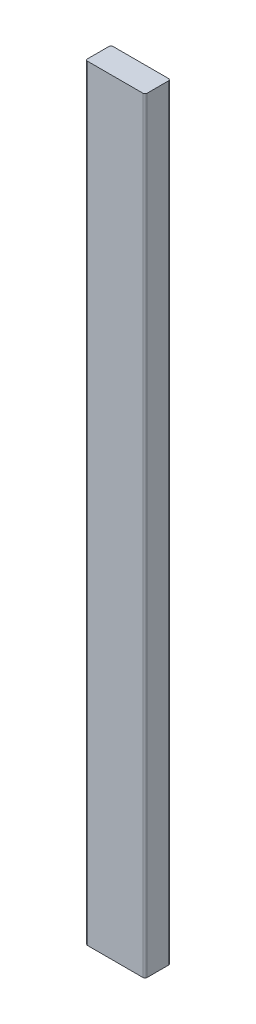
ISO-10303-21;
HEADER;
FILE_DESCRIPTION(('STEP AP214'),'2;1');
FILE_NAME('part.step','',(''),(''),'','','');
FILE_SCHEMA(('AUTOMOTIVE_DESIGN { 1 0 10303 214 1 1 1 1 }'));
ENDSEC;
DATA;
#1=APPLICATION_CONTEXT('core data for automotive mechanical design processes');
#2=APPLICATION_PROTOCOL_DEFINITION('international standard','automotive_design',2000,#1);
#3=PRODUCT_CONTEXT('',#1,'mechanical');
#4=PRODUCT('Part','Part','',(#3));
#5=PRODUCT_RELATED_PRODUCT_CATEGORY('part','',(#4));
#6=PRODUCT_DEFINITION_FORMATION('','',#4);
#7=PRODUCT_DEFINITION_CONTEXT('part definition',#1,'design');
#8=PRODUCT_DEFINITION('design','',#6,#7);
#9=PRODUCT_DEFINITION_SHAPE('','',#8);
#10=(LENGTH_UNIT() NAMED_UNIT(*) SI_UNIT(.MILLI.,.METRE.));
#11=(NAMED_UNIT(*) PLANE_ANGLE_UNIT() SI_UNIT($,.RADIAN.));
#12=(NAMED_UNIT(*) SI_UNIT($,.STERADIAN.) SOLID_ANGLE_UNIT());
#13=UNCERTAINTY_MEASURE_WITH_UNIT(LENGTH_MEASURE(1.E-05),#10,'distance_accuracy_value','');
#14=(GEOMETRIC_REPRESENTATION_CONTEXT(3) GLOBAL_UNCERTAINTY_ASSIGNED_CONTEXT((#13)) GLOBAL_UNIT_ASSIGNED_CONTEXT((#10,
#11,#12)) REPRESENTATION_CONTEXT('',''));
#15=CARTESIAN_POINT('',(0.,0.,0.));
#16=DIRECTION('',(0.,0.,1.));
#17=DIRECTION('',(1.,0.,0.));
#18=AXIS2_PLACEMENT_3D('',#15,#16,#17);
#19=CARTESIAN_POINT('',(-44.45,1143.,-19.05));
#20=DIRECTION('',(1.,0.,0.));
#21=DIRECTION('',(0.,0.,-1.));
#22=AXIS2_PLACEMENT_3D('',#19,#20,#21);
#23=PLANE('',#22);
#24=DIRECTION('',(0.,0.,1.));
#25=VECTOR('',#24,1.);
#26=CARTESIAN_POINT('',(-44.45,0.,-19.05));
#27=LINE('',#26,#25);
#28=CARTESIAN_POINT('',(-44.45,0.,-15.8749999999999));
#29=VERTEX_POINT('',#28);
#30=CARTESIAN_POINT('',(-44.45,0.,15.8750000000001));
#31=VERTEX_POINT('',#30);
#32=EDGE_CURVE('E127',#29,#31,#27,.T.);
#33=ORIENTED_EDGE('',*,*,#32,.T.);
#34=DIRECTION('',(0.,-1.,0.));
#35=VECTOR('',#34,1.);
#36=CARTESIAN_POINT('',(-44.4499999999997,1143.,15.8750000000001));
#37=LINE('',#36,#35);
#38=CARTESIAN_POINT('',(-44.4499999999997,1143.,15.8750000000001));
#39=VERTEX_POINT('',#38);
#40=EDGE_CURVE('E104',#31,#39,#37,.F.);
#41=ORIENTED_EDGE('',*,*,#40,.T.);
#42=DIRECTION('',(0.,0.,1.));
#43=VECTOR('',#42,1.);
#44=CARTESIAN_POINT('',(-44.45,1143.,-19.05));
#45=LINE('',#44,#43);
#46=CARTESIAN_POINT('',(-44.45,1143.,-15.8750000000001));
#47=VERTEX_POINT('',#46);
#48=EDGE_CURVE('E136',#47,#39,#45,.T.);
#49=ORIENTED_EDGE('',*,*,#48,.F.);
#50=DIRECTION('',(0.,-1.,0.));
#51=VECTOR('',#50,1.);
#52=CARTESIAN_POINT('',(-44.45,1143.,-15.8750000000001));
#53=LINE('',#52,#51);
#54=EDGE_CURVE('E109',#47,#29,#53,.T.);
#55=ORIENTED_EDGE('',*,*,#54,.T.);
#56=EDGE_LOOP('',(#33,#41,#49,#55));
#57=FACE_BOUND('',#56,.T.);
#58=ADVANCED_FACE('F32',(#57),#23,.F.);
#59=CARTESIAN_POINT('',(44.4500000000003,1143.,19.05));
#60=DIRECTION('',(0.,0.,-1.));
#61=DIRECTION('',(-1.,0.,0.));
#62=AXIS2_PLACEMENT_3D('',#59,#60,#61);
#63=PLANE('',#62);
#64=DIRECTION('',(1.,0.,0.));
#65=VECTOR('',#64,1.);
#66=CARTESIAN_POINT('',(44.4500000000003,1143.,19.05));
#67=LINE('',#66,#65);
#68=CARTESIAN_POINT('',(-41.2749999999997,1143.,19.05));
#69=VERTEX_POINT('',#68);
#70=CARTESIAN_POINT('',(41.2750000000003,1143.,19.05));
#71=VERTEX_POINT('',#70);
#72=EDGE_CURVE('E119',#69,#71,#67,.T.);
#73=ORIENTED_EDGE('',*,*,#72,.F.);
#74=DIRECTION('',(0.,-1.,0.));
#75=VECTOR('',#74,1.);
#76=CARTESIAN_POINT('',(-41.2749999999997,1143.,19.05));
#77=LINE('',#76,#75);
#78=CARTESIAN_POINT('',(-41.275,0.,19.05));
#79=VERTEX_POINT('',#78);
#80=EDGE_CURVE('E103',#69,#79,#77,.T.);
#81=ORIENTED_EDGE('',*,*,#80,.T.);
#82=DIRECTION('',(1.,0.,0.));
#83=VECTOR('',#82,1.);
#84=CARTESIAN_POINT('',(44.45,0.,19.05));
#85=LINE('',#84,#83);
#86=CARTESIAN_POINT('',(41.275,0.,19.05));
#87=VERTEX_POINT('',#86);
#88=EDGE_CURVE('E116',#79,#87,#85,.T.);
#89=ORIENTED_EDGE('',*,*,#88,.T.);
#90=DIRECTION('',(0.,-1.,0.));
#91=VECTOR('',#90,1.);
#92=CARTESIAN_POINT('',(41.2750000000003,1143.,19.05));
#93=LINE('',#92,#91);
#94=EDGE_CURVE('E121',#87,#71,#93,.F.);
#95=ORIENTED_EDGE('',*,*,#94,.T.);
#96=EDGE_LOOP('',(#73,#81,#89,#95));
#97=FACE_BOUND('',#96,.T.);
#98=ADVANCED_FACE('F115',(#97),#63,.F.);
#99=CARTESIAN_POINT('',(44.45,1143.,-19.05));
#100=DIRECTION('',(-1.,0.,0.));
#101=DIRECTION('',(0.,0.,1.));
#102=AXIS2_PLACEMENT_3D('',#99,#100,#101);
#103=PLANE('',#102);
#104=DIRECTION('',(0.,0.,-1.));
#105=VECTOR('',#104,1.);
#106=CARTESIAN_POINT('',(44.45,1143.,-19.05));
#107=LINE('',#106,#105);
#108=CARTESIAN_POINT('',(44.4500000000003,1143.,15.8749999999999));
#109=VERTEX_POINT('',#108);
#110=CARTESIAN_POINT('',(44.45,1143.,-15.8750000000001));
#111=VERTEX_POINT('',#110);
#112=EDGE_CURVE('E159',#109,#111,#107,.T.);
#113=ORIENTED_EDGE('',*,*,#112,.F.);
#114=DIRECTION('',(0.,-1.,0.));
#115=VECTOR('',#114,1.);
#116=CARTESIAN_POINT('',(44.4500000000003,1143.,15.8749999999999));
#117=LINE('',#116,#115);
#118=CARTESIAN_POINT('',(44.45,0.,15.8749999999999));
#119=VERTEX_POINT('',#118);
#120=EDGE_CURVE('E11',#109,#119,#117,.T.);
#121=ORIENTED_EDGE('',*,*,#120,.T.);
#122=DIRECTION('',(0.,0.,-1.));
#123=VECTOR('',#122,1.);
#124=CARTESIAN_POINT('',(44.45,0.,-19.05));
#125=LINE('',#124,#123);
#126=CARTESIAN_POINT('',(44.45,0.,-15.8750000000001));
#127=VERTEX_POINT('',#126);
#128=EDGE_CURVE('E126',#119,#127,#125,.T.);
#129=ORIENTED_EDGE('',*,*,#128,.T.);
#130=DIRECTION('',(0.,-1.,0.));
#131=VECTOR('',#130,1.);
#132=CARTESIAN_POINT('',(44.45,1143.,-15.8750000000001));
#133=LINE('',#132,#131);
#134=EDGE_CURVE('E40',#127,#111,#133,.F.);
#135=ORIENTED_EDGE('',*,*,#134,.T.);
#136=EDGE_LOOP('',(#113,#121,#129,#135));
#137=FACE_BOUND('',#136,.T.);
#138=ADVANCED_FACE('F158',(#137),#103,.F.);
#139=CARTESIAN_POINT('',(44.45,1143.,-19.05));
#140=DIRECTION('',(0.,0.,1.));
#141=DIRECTION('',(1.,0.,0.));
#142=AXIS2_PLACEMENT_3D('',#139,#140,#141);
#143=PLANE('',#142);
#144=DIRECTION('',(-1.,0.,0.));
#145=VECTOR('',#144,1.);
#146=CARTESIAN_POINT('',(44.45,0.,-19.05));
#147=LINE('',#146,#145);
#148=CARTESIAN_POINT('',(41.275,0.,-19.05));
#149=VERTEX_POINT('',#148);
#150=CARTESIAN_POINT('',(-41.275,0.,-19.05));
#151=VERTEX_POINT('',#150);
#152=EDGE_CURVE('E130',#149,#151,#147,.T.);
#153=ORIENTED_EDGE('',*,*,#152,.T.);
#154=DIRECTION('',(0.,-1.,0.));
#155=VECTOR('',#154,1.);
#156=CARTESIAN_POINT('',(-41.2749999999999,1143.,-19.05));
#157=LINE('',#156,#155);
#158=CARTESIAN_POINT('',(-41.2749999999999,1143.,-19.05));
#159=VERTEX_POINT('',#158);
#160=EDGE_CURVE('E47',#151,#159,#157,.F.);
#161=ORIENTED_EDGE('',*,*,#160,.T.);
#162=DIRECTION('',(-1.,0.,0.));
#163=VECTOR('',#162,1.);
#164=CARTESIAN_POINT('',(44.45,1143.,-19.05));
#165=LINE('',#164,#163);
#166=CARTESIAN_POINT('',(41.275,1143.,-19.05));
#167=VERTEX_POINT('',#166);
#168=EDGE_CURVE('E137',#167,#159,#165,.T.);
#169=ORIENTED_EDGE('',*,*,#168,.F.);
#170=DIRECTION('',(0.,-1.,0.));
#171=VECTOR('',#170,1.);
#172=CARTESIAN_POINT('',(41.275,1143.,-19.05));
#173=LINE('',#172,#171);
#174=EDGE_CURVE('E152',#167,#149,#173,.T.);
#175=ORIENTED_EDGE('',*,*,#174,.T.);
#176=EDGE_LOOP('',(#153,#161,#169,#175));
#177=FACE_BOUND('',#176,.T.);
#178=ADVANCED_FACE('F168',(#177),#143,.F.);
#179=CARTESIAN_POINT('',(0.,1143.,0.));
#180=DIRECTION('',(0.,-1.,0.));
#181=DIRECTION('',(0.,0.,-1.));
#182=AXIS2_PLACEMENT_3D('',#179,#180,#181);
#183=PLANE('',#182);
#184=ORIENTED_EDGE('',*,*,#48,.T.);
#185=CARTESIAN_POINT('',(-41.2749999999997,1143.,15.8750000000001));
#186=DIRECTION('',(0.,-1.,0.));
#187=DIRECTION('',(0.,0.,-1.));
#188=AXIS2_PLACEMENT_3D('',#185,#186,#187);
#189=CIRCLE('',#188,3.175);
#190=EDGE_CURVE('E150',#39,#69,#189,.F.);
#191=ORIENTED_EDGE('',*,*,#190,.T.);
#192=ORIENTED_EDGE('',*,*,#72,.T.);
#193=CARTESIAN_POINT('',(41.2750000000003,1143.,15.8749999999999));
#194=DIRECTION('',(0.,-1.,0.));
#195=DIRECTION('',(0.,0.,-1.));
#196=AXIS2_PLACEMENT_3D('',#193,#194,#195);
#197=CIRCLE('',#196,3.175);
#198=EDGE_CURVE('E146',#71,#109,#197,.F.);
#199=ORIENTED_EDGE('',*,*,#198,.T.);
#200=ORIENTED_EDGE('',*,*,#112,.T.);
#201=CARTESIAN_POINT('',(41.275,1143.,-15.8750000000001));
#202=DIRECTION('',(0.,-1.,0.));
#203=DIRECTION('',(0.,0.,-1.));
#204=AXIS2_PLACEMENT_3D('',#201,#202,#203);
#205=CIRCLE('',#204,3.175);
#206=EDGE_CURVE('E54',#111,#167,#205,.F.);
#207=ORIENTED_EDGE('',*,*,#206,.T.);
#208=ORIENTED_EDGE('',*,*,#168,.T.);
#209=CARTESIAN_POINT('',(-41.2749999999999,1143.,-15.8750000000001));
#210=DIRECTION('',(0.,-1.,0.));
#211=DIRECTION('',(0.,0.,-1.));
#212=AXIS2_PLACEMENT_3D('',#209,#210,#211);
#213=CIRCLE('',#212,3.175);
#214=EDGE_CURVE('E148',#159,#47,#213,.F.);
#215=ORIENTED_EDGE('',*,*,#214,.T.);
#216=EDGE_LOOP('',(#184,#191,#192,#199,#200,#207,#208,#215));
#217=FACE_BOUND('',#216,.T.);
#218=ADVANCED_FACE('F163',(#217),#183,.F.);
#219=CARTESIAN_POINT('',(0.,0.,0.));
#220=DIRECTION('',(0.,-1.,0.));
#221=DIRECTION('',(0.,0.,-1.));
#222=AXIS2_PLACEMENT_3D('',#219,#220,#221);
#223=PLANE('',#222);
#224=ORIENTED_EDGE('',*,*,#88,.F.);
#225=CARTESIAN_POINT('',(-41.275,0.,15.8750000000001));
#226=DIRECTION('',(0.,-1.,0.));
#227=DIRECTION('',(0.,0.,-1.));
#228=AXIS2_PLACEMENT_3D('',#225,#226,#227);
#229=CIRCLE('',#228,3.175);
#230=EDGE_CURVE('E99',#79,#31,#229,.T.);
#231=ORIENTED_EDGE('',*,*,#230,.T.);
#232=ORIENTED_EDGE('',*,*,#32,.F.);
#233=CARTESIAN_POINT('',(-41.275,0.,-15.8750000000001));
#234=DIRECTION('',(0.,-1.,0.));
#235=DIRECTION('',(0.,0.,-1.));
#236=AXIS2_PLACEMENT_3D('',#233,#234,#235);
#237=CIRCLE('',#236,3.175);
#238=EDGE_CURVE('E110',#29,#151,#237,.T.);
#239=ORIENTED_EDGE('',*,*,#238,.T.);
#240=ORIENTED_EDGE('',*,*,#152,.F.);
#241=CARTESIAN_POINT('',(41.275,0.,-15.8750000000001));
#242=DIRECTION('',(0.,-1.,0.));
#243=DIRECTION('',(0.,0.,-1.));
#244=AXIS2_PLACEMENT_3D('',#241,#242,#243);
#245=CIRCLE('',#244,3.175);
#246=EDGE_CURVE('E120',#149,#127,#245,.T.);
#247=ORIENTED_EDGE('',*,*,#246,.T.);
#248=ORIENTED_EDGE('',*,*,#128,.F.);
#249=CARTESIAN_POINT('',(41.275,0.,15.8750000000001));
#250=DIRECTION('',(0.,-1.,0.));
#251=DIRECTION('',(0.,0.,-1.));
#252=AXIS2_PLACEMENT_3D('',#249,#250,#251);
#253=CIRCLE('',#252,3.175);
#254=EDGE_CURVE('E125',#119,#87,#253,.T.);
#255=ORIENTED_EDGE('',*,*,#254,.T.);
#256=EDGE_LOOP('',(#224,#231,#232,#239,#240,#247,#248,#255));
#257=FACE_BOUND('',#256,.T.);
#258=ADVANCED_FACE('F123',(#257),#223,.T.);
#259=CARTESIAN_POINT('',(-41.2749999999997,1143.,15.8750000000001));
#260=DIRECTION('',(0.,-1.,0.));
#261=DIRECTION('',(0.,0.,-1.));
#262=AXIS2_PLACEMENT_3D('',#259,#260,#261);
#263=CYLINDRICAL_SURFACE('',#262,3.175);
#264=ORIENTED_EDGE('',*,*,#190,.F.);
#265=ORIENTED_EDGE('',*,*,#40,.F.);
#266=ORIENTED_EDGE('',*,*,#230,.F.);
#267=ORIENTED_EDGE('',*,*,#80,.F.);
#268=EDGE_LOOP('',(#264,#265,#266,#267));
#269=FACE_BOUND('',#268,.T.);
#270=ADVANCED_FACE('F102',(#269),#263,.T.);
#271=CARTESIAN_POINT('',(-41.2749999999999,1143.,-15.8750000000001));
#272=DIRECTION('',(0.,-1.,0.));
#273=DIRECTION('',(0.,0.,-1.));
#274=AXIS2_PLACEMENT_3D('',#271,#272,#273);
#275=CYLINDRICAL_SURFACE('',#274,3.175);
#276=ORIENTED_EDGE('',*,*,#214,.F.);
#277=ORIENTED_EDGE('',*,*,#160,.F.);
#278=ORIENTED_EDGE('',*,*,#238,.F.);
#279=ORIENTED_EDGE('',*,*,#54,.F.);
#280=EDGE_LOOP('',(#276,#277,#278,#279));
#281=FACE_BOUND('',#280,.T.);
#282=ADVANCED_FACE('F172',(#281),#275,.T.);
#283=CARTESIAN_POINT('',(41.2750000000003,1143.,15.8749999999999));
#284=DIRECTION('',(0.,-1.,0.));
#285=DIRECTION('',(0.,0.,-1.));
#286=AXIS2_PLACEMENT_3D('',#283,#284,#285);
#287=CYLINDRICAL_SURFACE('',#286,3.175);
#288=ORIENTED_EDGE('',*,*,#198,.F.);
#289=ORIENTED_EDGE('',*,*,#94,.F.);
#290=ORIENTED_EDGE('',*,*,#254,.F.);
#291=ORIENTED_EDGE('',*,*,#120,.F.);
#292=EDGE_LOOP('',(#288,#289,#290,#291));
#293=FACE_BOUND('',#292,.T.);
#294=ADVANCED_FACE('F178',(#293),#287,.T.);
#295=CARTESIAN_POINT('',(41.275,1143.,-15.8750000000001));
#296=DIRECTION('',(0.,-1.,0.));
#297=DIRECTION('',(0.,0.,-1.));
#298=AXIS2_PLACEMENT_3D('',#295,#296,#297);
#299=CYLINDRICAL_SURFACE('',#298,3.175);
#300=ORIENTED_EDGE('',*,*,#206,.F.);
#301=ORIENTED_EDGE('',*,*,#134,.F.);
#302=ORIENTED_EDGE('',*,*,#246,.F.);
#303=ORIENTED_EDGE('',*,*,#174,.F.);
#304=EDGE_LOOP('',(#300,#301,#302,#303));
#305=FACE_BOUND('',#304,.T.);
#306=ADVANCED_FACE('F34',(#305),#299,.T.);
#307=CLOSED_SHELL('',(#58,#98,#138,#178,#218,#258,#270,#282,#294,#306));
#308=MANIFOLD_SOLID_BREP('B2',#307);
#309=ADVANCED_BREP_SHAPE_REPRESENTATION('',(#18,#308),#14);
#310=SHAPE_DEFINITION_REPRESENTATION(#9,#309);
ENDSEC;
END-ISO-10303-21;
